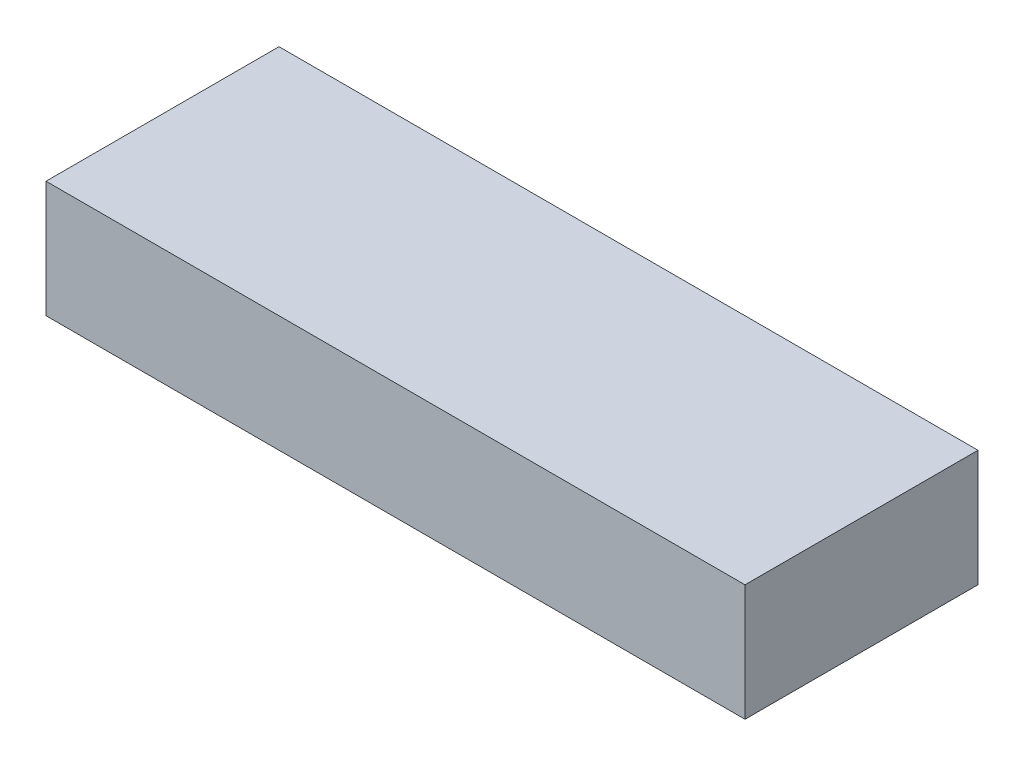
ISO-10303-21;
HEADER;
FILE_DESCRIPTION(('STEP AP214'),'2;1');
FILE_NAME('part.step','',(''),(''),'','','');
FILE_SCHEMA(('AUTOMOTIVE_DESIGN { 1 0 10303 214 1 1 1 1 }'));
ENDSEC;
DATA;
#1=APPLICATION_CONTEXT('core data for automotive mechanical design processes');
#2=APPLICATION_PROTOCOL_DEFINITION('international standard','automotive_design',2000,#1);
#3=PRODUCT_CONTEXT('',#1,'mechanical');
#4=PRODUCT('Part','Part','',(#3));
#5=PRODUCT_RELATED_PRODUCT_CATEGORY('part','',(#4));
#6=PRODUCT_DEFINITION_FORMATION('','',#4);
#7=PRODUCT_DEFINITION_CONTEXT('part definition',#1,'design');
#8=PRODUCT_DEFINITION('design','',#6,#7);
#9=PRODUCT_DEFINITION_SHAPE('','',#8);
#10=(LENGTH_UNIT() NAMED_UNIT(*) SI_UNIT(.MILLI.,.METRE.));
#11=(NAMED_UNIT(*) PLANE_ANGLE_UNIT() SI_UNIT($,.RADIAN.));
#12=(NAMED_UNIT(*) SI_UNIT($,.STERADIAN.) SOLID_ANGLE_UNIT());
#13=UNCERTAINTY_MEASURE_WITH_UNIT(LENGTH_MEASURE(1.E-05),#10,'distance_accuracy_value','');
#14=(GEOMETRIC_REPRESENTATION_CONTEXT(3) GLOBAL_UNCERTAINTY_ASSIGNED_CONTEXT((#13)) GLOBAL_UNIT_ASSIGNED_CONTEXT((#10,
#11,#12)) REPRESENTATION_CONTEXT('',''));
#15=CARTESIAN_POINT('',(0.,0.,0.));
#16=DIRECTION('',(0.,0.,1.));
#17=DIRECTION('',(1.,0.,0.));
#18=AXIS2_PLACEMENT_3D('',#15,#16,#17);
#19=CARTESIAN_POINT('',(90.,-15.,30.));
#20=DIRECTION('',(1.,0.,0.));
#21=DIRECTION('',(0.,0.,-1.));
#22=AXIS2_PLACEMENT_3D('',#19,#20,#21);
#23=PLANE('',#22);
#24=DIRECTION('',(0.,1.,0.));
#25=VECTOR('',#24,1.);
#26=CARTESIAN_POINT('',(90.,-15.,-30.));
#27=LINE('',#26,#25);
#28=CARTESIAN_POINT('',(90.,-15.,-30.));
#29=VERTEX_POINT('',#28);
#30=CARTESIAN_POINT('',(90.,15.,-30.));
#31=VERTEX_POINT('',#30);
#32=EDGE_CURVE('E43',#29,#31,#27,.T.);
#33=ORIENTED_EDGE('',*,*,#32,.T.);
#34=DIRECTION('',(0.,0.,-1.));
#35=VECTOR('',#34,1.);
#36=CARTESIAN_POINT('',(90.,15.,30.));
#37=LINE('',#36,#35);
#38=CARTESIAN_POINT('',(90.,15.,30.));
#39=VERTEX_POINT('',#38);
#40=EDGE_CURVE('E80',#39,#31,#37,.T.);
#41=ORIENTED_EDGE('',*,*,#40,.F.);
#42=DIRECTION('',(0.,1.,0.));
#43=VECTOR('',#42,1.);
#44=CARTESIAN_POINT('',(90.,-15.,30.));
#45=LINE('',#44,#43);
#46=CARTESIAN_POINT('',(90.,-15.,30.));
#47=VERTEX_POINT('',#46);
#48=EDGE_CURVE('E11',#47,#39,#45,.T.);
#49=ORIENTED_EDGE('',*,*,#48,.F.);
#50=DIRECTION('',(0.,0.,-1.));
#51=VECTOR('',#50,1.);
#52=CARTESIAN_POINT('',(90.,-15.,30.));
#53=LINE('',#52,#51);
#54=EDGE_CURVE('E81',#47,#29,#53,.T.);
#55=ORIENTED_EDGE('',*,*,#54,.T.);
#56=EDGE_LOOP('',(#33,#41,#49,#55));
#57=FACE_BOUND('',#56,.T.);
#58=ADVANCED_FACE('F40',(#57),#23,.T.);
#59=CARTESIAN_POINT('',(-90.,-15.,30.));
#60=DIRECTION('',(0.,0.,1.));
#61=DIRECTION('',(1.,0.,0.));
#62=AXIS2_PLACEMENT_3D('',#59,#60,#61);
#63=PLANE('',#62);
#64=ORIENTED_EDGE('',*,*,#48,.T.);
#65=DIRECTION('',(1.,0.,0.));
#66=VECTOR('',#65,1.);
#67=CARTESIAN_POINT('',(-90.,15.,30.));
#68=LINE('',#67,#66);
#69=CARTESIAN_POINT('',(-90.,15.,30.));
#70=VERTEX_POINT('',#69);
#71=EDGE_CURVE('E97',#70,#39,#68,.T.);
#72=ORIENTED_EDGE('',*,*,#71,.F.);
#73=DIRECTION('',(0.,1.,0.));
#74=VECTOR('',#73,1.);
#75=CARTESIAN_POINT('',(-90.,-15.,30.));
#76=LINE('',#75,#74);
#77=CARTESIAN_POINT('',(-90.,-15.,30.));
#78=VERTEX_POINT('',#77);
#79=EDGE_CURVE('E48',#78,#70,#76,.T.);
#80=ORIENTED_EDGE('',*,*,#79,.F.);
#81=DIRECTION('',(1.,0.,0.));
#82=VECTOR('',#81,1.);
#83=CARTESIAN_POINT('',(-90.,-15.,30.));
#84=LINE('',#83,#82);
#85=EDGE_CURVE('E86',#78,#47,#84,.T.);
#86=ORIENTED_EDGE('',*,*,#85,.T.);
#87=EDGE_LOOP('',(#64,#72,#80,#86));
#88=FACE_BOUND('',#87,.T.);
#89=ADVANCED_FACE('F112',(#88),#63,.T.);
#90=CARTESIAN_POINT('',(-90.,-15.,30.));
#91=DIRECTION('',(-1.,0.,0.));
#92=DIRECTION('',(0.,0.,1.));
#93=AXIS2_PLACEMENT_3D('',#90,#91,#92);
#94=PLANE('',#93);
#95=ORIENTED_EDGE('',*,*,#79,.T.);
#96=DIRECTION('',(0.,0.,1.));
#97=VECTOR('',#96,1.);
#98=CARTESIAN_POINT('',(-90.,15.,30.));
#99=LINE('',#98,#97);
#100=CARTESIAN_POINT('',(-90.,15.,-30.));
#101=VERTEX_POINT('',#100);
#102=EDGE_CURVE('E93',#101,#70,#99,.T.);
#103=ORIENTED_EDGE('',*,*,#102,.F.);
#104=DIRECTION('',(0.,1.,0.));
#105=VECTOR('',#104,1.);
#106=CARTESIAN_POINT('',(-90.,-15.,-30.));
#107=LINE('',#106,#105);
#108=CARTESIAN_POINT('',(-90.,-15.,-30.));
#109=VERTEX_POINT('',#108);
#110=EDGE_CURVE('E85',#109,#101,#107,.T.);
#111=ORIENTED_EDGE('',*,*,#110,.F.);
#112=DIRECTION('',(0.,0.,1.));
#113=VECTOR('',#112,1.);
#114=CARTESIAN_POINT('',(-90.,-15.,30.));
#115=LINE('',#114,#113);
#116=EDGE_CURVE('E105',#109,#78,#115,.T.);
#117=ORIENTED_EDGE('',*,*,#116,.T.);
#118=EDGE_LOOP('',(#95,#103,#111,#117));
#119=FACE_BOUND('',#118,.T.);
#120=ADVANCED_FACE('F109',(#119),#94,.T.);
#121=CARTESIAN_POINT('',(-90.,-15.,-30.));
#122=DIRECTION('',(0.,0.,-1.));
#123=DIRECTION('',(-1.,0.,0.));
#124=AXIS2_PLACEMENT_3D('',#121,#122,#123);
#125=PLANE('',#124);
#126=ORIENTED_EDGE('',*,*,#110,.T.);
#127=DIRECTION('',(-1.,0.,0.));
#128=VECTOR('',#127,1.);
#129=CARTESIAN_POINT('',(-90.,15.,-30.));
#130=LINE('',#129,#128);
#131=EDGE_CURVE('E88',#31,#101,#130,.T.);
#132=ORIENTED_EDGE('',*,*,#131,.F.);
#133=ORIENTED_EDGE('',*,*,#32,.F.);
#134=DIRECTION('',(-1.,0.,0.));
#135=VECTOR('',#134,1.);
#136=CARTESIAN_POINT('',(-90.,-15.,-30.));
#137=LINE('',#136,#135);
#138=EDGE_CURVE('E103',#29,#109,#137,.T.);
#139=ORIENTED_EDGE('',*,*,#138,.T.);
#140=EDGE_LOOP('',(#126,#132,#133,#139));
#141=FACE_BOUND('',#140,.T.);
#142=ADVANCED_FACE('F89',(#141),#125,.T.);
#143=CARTESIAN_POINT('',(0.,-15.,0.));
#144=DIRECTION('',(0.,-1.,0.));
#145=DIRECTION('',(0.,0.,-1.));
#146=AXIS2_PLACEMENT_3D('',#143,#144,#145);
#147=PLANE('',#146);
#148=ORIENTED_EDGE('',*,*,#54,.F.);
#149=ORIENTED_EDGE('',*,*,#85,.F.);
#150=ORIENTED_EDGE('',*,*,#116,.F.);
#151=ORIENTED_EDGE('',*,*,#138,.F.);
#152=EDGE_LOOP('',(#148,#149,#150,#151));
#153=FACE_BOUND('',#152,.T.);
#154=ADVANCED_FACE('F114',(#153),#147,.T.);
#155=CARTESIAN_POINT('',(0.,15.,0.));
#156=DIRECTION('',(0.,-1.,0.));
#157=DIRECTION('',(0.,0.,-1.));
#158=AXIS2_PLACEMENT_3D('',#155,#156,#157);
#159=PLANE('',#158);
#160=ORIENTED_EDGE('',*,*,#40,.T.);
#161=ORIENTED_EDGE('',*,*,#131,.T.);
#162=ORIENTED_EDGE('',*,*,#102,.T.);
#163=ORIENTED_EDGE('',*,*,#71,.T.);
#164=EDGE_LOOP('',(#160,#161,#162,#163));
#165=FACE_BOUND('',#164,.T.);
#166=ADVANCED_FACE('F96',(#165),#159,.F.);
#167=CLOSED_SHELL('',(#58,#89,#120,#142,#154,#166));
#168=MANIFOLD_SOLID_BREP('B2',#167);
#169=ADVANCED_BREP_SHAPE_REPRESENTATION('',(#18,#168),#14);
#170=SHAPE_DEFINITION_REPRESENTATION(#9,#169);
ENDSEC;
END-ISO-10303-21;
